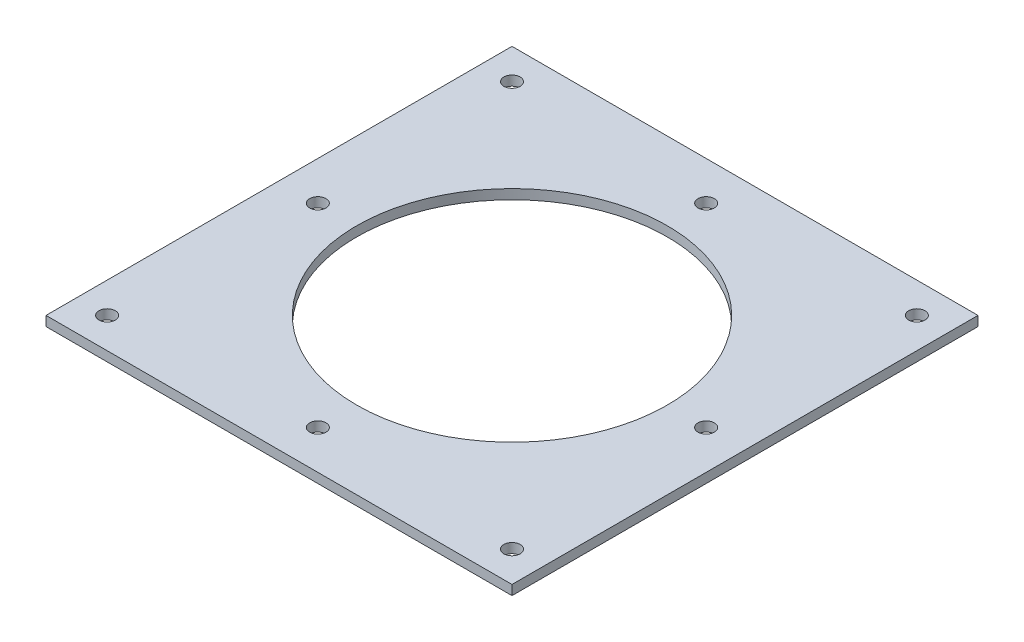
ISO-10303-21;
HEADER;
FILE_DESCRIPTION(('STEP AP214'),'2;1');
FILE_NAME('part.step','',(''),(''),'','','');
FILE_SCHEMA(('AUTOMOTIVE_DESIGN { 1 0 10303 214 1 1 1 1 }'));
ENDSEC;
DATA;
#1=APPLICATION_CONTEXT('core data for automotive mechanical design processes');
#2=APPLICATION_PROTOCOL_DEFINITION('international standard','automotive_design',2000,#1);
#3=PRODUCT_CONTEXT('',#1,'mechanical');
#4=PRODUCT('Part','Part','',(#3));
#5=PRODUCT_RELATED_PRODUCT_CATEGORY('part','',(#4));
#6=PRODUCT_DEFINITION_FORMATION('','',#4);
#7=PRODUCT_DEFINITION_CONTEXT('part definition',#1,'design');
#8=PRODUCT_DEFINITION('design','',#6,#7);
#9=PRODUCT_DEFINITION_SHAPE('','',#8);
#10=(LENGTH_UNIT() NAMED_UNIT(*) SI_UNIT(.MILLI.,.METRE.));
#11=(NAMED_UNIT(*) PLANE_ANGLE_UNIT() SI_UNIT($,.RADIAN.));
#12=(NAMED_UNIT(*) SI_UNIT($,.STERADIAN.) SOLID_ANGLE_UNIT());
#13=UNCERTAINTY_MEASURE_WITH_UNIT(LENGTH_MEASURE(1.E-05),#10,'distance_accuracy_value','');
#14=(GEOMETRIC_REPRESENTATION_CONTEXT(3) GLOBAL_UNCERTAINTY_ASSIGNED_CONTEXT((#13)) GLOBAL_UNIT_ASSIGNED_CONTEXT((#10,
#11,#12)) REPRESENTATION_CONTEXT('',''));
#15=CARTESIAN_POINT('',(0.,0.,0.));
#16=DIRECTION('',(0.,0.,1.));
#17=DIRECTION('',(1.,0.,0.));
#18=AXIS2_PLACEMENT_3D('',#15,#16,#17);
#19=CARTESIAN_POINT('',(0.,3.175,0.));
#20=DIRECTION('',(0.,-1.,0.));
#21=DIRECTION('',(0.,0.,-1.));
#22=AXIS2_PLACEMENT_3D('',#19,#20,#21);
#23=PLANE('',#22);
#24=CARTESIAN_POINT('',(3.80130471627234E-13,3.175,-63.5000000000003));
#25=DIRECTION('',(0.,1.,0.));
#26=DIRECTION('',(0.,0.,1.));
#27=AXIS2_PLACEMENT_3D('',#24,#25,#26);
#28=CIRCLE('',#27,2.66500000400001);
#29=CARTESIAN_POINT('',(3.80130471627234E-13,3.175,-60.8349999960003));
#30=VERTEX_POINT('',#29);
#31=EDGE_CURVE('E155',#30,#30,#28,.T.);
#32=ORIENTED_EDGE('',*,*,#31,.F.);
#33=EDGE_LOOP('',(#32));
#34=FACE_BOUND('',#33,.T.);
#35=CARTESIAN_POINT('',(-63.5000000000001,3.175,-4.91794105439425E-13));
#36=DIRECTION('',(0.,1.,0.));
#37=DIRECTION('',(0.,0.,1.));
#38=AXIS2_PLACEMENT_3D('',#35,#36,#37);
#39=CIRCLE('',#38,2.66500000399999);
#40=CARTESIAN_POINT('',(-63.5000000000001,3.175,2.66500000399949));
#41=VERTEX_POINT('',#40);
#42=EDGE_CURVE('E191',#41,#41,#39,.T.);
#43=ORIENTED_EDGE('',*,*,#42,.F.);
#44=EDGE_LOOP('',(#43));
#45=FACE_BOUND('',#44,.T.);
#46=CARTESIAN_POINT('',(0.,3.175,63.4999999999997));
#47=DIRECTION('',(0.,1.,0.));
#48=DIRECTION('',(0.,0.,1.));
#49=AXIS2_PLACEMENT_3D('',#46,#47,#48);
#50=CIRCLE('',#49,2.66500000400001);
#51=CARTESIAN_POINT('',(0.,3.175,66.1650000039997));
#52=VERTEX_POINT('',#51);
#53=EDGE_CURVE('E183',#52,#52,#50,.T.);
#54=ORIENTED_EDGE('',*,*,#53,.F.);
#55=EDGE_LOOP('',(#54));
#56=FACE_BOUND('',#55,.T.);
#57=CARTESIAN_POINT('',(63.4999999999999,3.175,3.79904441238921E-13));
#58=DIRECTION('',(0.,1.,0.));
#59=DIRECTION('',(0.,0.,1.));
#60=AXIS2_PLACEMENT_3D('',#57,#58,#59);
#61=CIRCLE('',#60,2.665000004);
#62=CARTESIAN_POINT('',(63.4999999999999,3.175,2.66500000400038));
#63=VERTEX_POINT('',#62);
#64=EDGE_CURVE('E176',#63,#63,#61,.T.);
#65=ORIENTED_EDGE('',*,*,#64,.F.);
#66=EDGE_LOOP('',(#65));
#67=FACE_BOUND('',#66,.T.);
#68=CARTESIAN_POINT('',(66.2,3.175,66.2));
#69=DIRECTION('',(0.,1.,0.));
#70=DIRECTION('',(0.,0.,-1.));
#71=AXIS2_PLACEMENT_3D('',#68,#69,#70);
#72=CIRCLE('',#71,2.665000004);
#73=CARTESIAN_POINT('',(66.2,3.175,63.534999996));
#74=VERTEX_POINT('',#73);
#75=EDGE_CURVE('E154',#74,#74,#72,.T.);
#76=ORIENTED_EDGE('',*,*,#75,.F.);
#77=EDGE_LOOP('',(#76));
#78=FACE_BOUND('',#77,.T.);
#79=CARTESIAN_POINT('',(66.2,3.175,-66.2));
#80=DIRECTION('',(0.,1.,0.));
#81=DIRECTION('',(0.,0.,1.));
#82=AXIS2_PLACEMENT_3D('',#79,#80,#81);
#83=CIRCLE('',#82,2.665000004);
#84=CARTESIAN_POINT('',(66.2,3.175,-63.534999996));
#85=VERTEX_POINT('',#84);
#86=EDGE_CURVE('E162',#85,#85,#83,.T.);
#87=ORIENTED_EDGE('',*,*,#86,.F.);
#88=EDGE_LOOP('',(#87));
#89=FACE_BOUND('',#88,.T.);
#90=CARTESIAN_POINT('',(-66.2,3.175,-66.2));
#91=DIRECTION('',(0.,1.,0.));
#92=DIRECTION('',(0.,0.,-1.));
#93=AXIS2_PLACEMENT_3D('',#90,#91,#92);
#94=CIRCLE('',#93,2.665000004);
#95=CARTESIAN_POINT('',(-66.2,3.175,-68.865000004));
#96=VERTEX_POINT('',#95);
#97=EDGE_CURVE('E147',#96,#96,#94,.T.);
#98=ORIENTED_EDGE('',*,*,#97,.F.);
#99=EDGE_LOOP('',(#98));
#100=FACE_BOUND('',#99,.T.);
#101=CARTESIAN_POINT('',(-66.2,3.175,66.2));
#102=DIRECTION('',(0.,1.,0.));
#103=DIRECTION('',(0.,0.,1.));
#104=AXIS2_PLACEMENT_3D('',#101,#102,#103);
#105=CIRCLE('',#104,2.665000004);
#106=CARTESIAN_POINT('',(-66.2,3.175,68.865000004));
#107=VERTEX_POINT('',#106);
#108=EDGE_CURVE('E140',#107,#107,#105,.T.);
#109=ORIENTED_EDGE('',*,*,#108,.F.);
#110=EDGE_LOOP('',(#109));
#111=FACE_BOUND('',#110,.T.);
#112=DIRECTION('',(0.,0.,-1.));
#113=VECTOR('',#112,1.);
#114=CARTESIAN_POINT('',(76.2,3.175,76.2));
#115=LINE('',#114,#113);
#116=CARTESIAN_POINT('',(76.2,3.175,76.2));
#117=VERTEX_POINT('',#116);
#118=CARTESIAN_POINT('',(76.2,3.175,-76.2));
#119=VERTEX_POINT('',#118);
#120=EDGE_CURVE('E95',#117,#119,#115,.T.);
#121=ORIENTED_EDGE('',*,*,#120,.T.);
#122=DIRECTION('',(-1.,0.,0.));
#123=VECTOR('',#122,1.);
#124=CARTESIAN_POINT('',(-76.2,3.175,-76.2));
#125=LINE('',#124,#123);
#126=CARTESIAN_POINT('',(-76.2,3.175,-76.2));
#127=VERTEX_POINT('',#126);
#128=EDGE_CURVE('E90',#119,#127,#125,.T.);
#129=ORIENTED_EDGE('',*,*,#128,.T.);
#130=DIRECTION('',(0.,0.,1.));
#131=VECTOR('',#130,1.);
#132=CARTESIAN_POINT('',(-76.2,3.175,76.2));
#133=LINE('',#132,#131);
#134=CARTESIAN_POINT('',(-76.2,3.175,76.2));
#135=VERTEX_POINT('',#134);
#136=EDGE_CURVE('E93',#127,#135,#133,.T.);
#137=ORIENTED_EDGE('',*,*,#136,.T.);
#138=DIRECTION('',(1.,0.,0.));
#139=VECTOR('',#138,1.);
#140=CARTESIAN_POINT('',(-76.2,3.175,76.2));
#141=LINE('',#140,#139);
#142=EDGE_CURVE('E58',#135,#117,#141,.T.);
#143=ORIENTED_EDGE('',*,*,#142,.T.);
#144=EDGE_LOOP('',(#121,#129,#137,#143));
#145=FACE_BOUND('',#144,.T.);
#146=CARTESIAN_POINT('',(0.,3.175,0.));
#147=DIRECTION('',(0.,1.,0.));
#148=DIRECTION('',(0.,0.,1.));
#149=AXIS2_PLACEMENT_3D('',#146,#147,#148);
#150=CIRCLE('',#149,50.8);
#151=CARTESIAN_POINT('',(0.,3.175,50.8));
#152=VERTEX_POINT('',#151);
#153=EDGE_CURVE('E116',#152,#152,#150,.T.);
#154=ORIENTED_EDGE('',*,*,#153,.F.);
#155=EDGE_LOOP('',(#154));
#156=FACE_BOUND('',#155,.T.);
#157=ADVANCED_FACE('F39',(#34,#45,#56,#67,#78,#89,#100,#111,#145,#156),#23,.F.);
#158=CARTESIAN_POINT('',(0.,0.,0.));
#159=DIRECTION('',(0.,-1.,0.));
#160=DIRECTION('',(0.,0.,-1.));
#161=AXIS2_PLACEMENT_3D('',#158,#159,#160);
#162=PLANE('',#161);
#163=CARTESIAN_POINT('',(3.80130471627234E-13,0.,-63.5000000000003));
#164=DIRECTION('',(0.,-1.,0.));
#165=DIRECTION('',(0.,0.,-1.));
#166=AXIS2_PLACEMENT_3D('',#163,#164,#165);
#167=CIRCLE('',#166,2.66500000400001);
#168=CARTESIAN_POINT('',(3.80130471627234E-13,0.,-66.1650000040003));
#169=VERTEX_POINT('',#168);
#170=EDGE_CURVE('E195',#169,#169,#167,.F.);
#171=ORIENTED_EDGE('',*,*,#170,.T.);
#172=EDGE_LOOP('',(#171));
#173=FACE_BOUND('',#172,.T.);
#174=CARTESIAN_POINT('',(-63.5000000000001,0.,-4.91794105439425E-13));
#175=DIRECTION('',(0.,-1.,0.));
#176=DIRECTION('',(0.,0.,-1.));
#177=AXIS2_PLACEMENT_3D('',#174,#175,#176);
#178=CIRCLE('',#177,2.66500000399999);
#179=CARTESIAN_POINT('',(-63.5000000000001,0.,-2.66500000400048));
#180=VERTEX_POINT('',#179);
#181=EDGE_CURVE('E187',#180,#180,#178,.F.);
#182=ORIENTED_EDGE('',*,*,#181,.T.);
#183=EDGE_LOOP('',(#182));
#184=FACE_BOUND('',#183,.T.);
#185=CARTESIAN_POINT('',(0.,0.,63.4999999999997));
#186=DIRECTION('',(0.,-1.,0.));
#187=DIRECTION('',(0.,0.,-1.));
#188=AXIS2_PLACEMENT_3D('',#185,#186,#187);
#189=CIRCLE('',#188,2.66500000400001);
#190=CARTESIAN_POINT('',(0.,0.,60.8349999959997));
#191=VERTEX_POINT('',#190);
#192=EDGE_CURVE('E179',#191,#191,#189,.F.);
#193=ORIENTED_EDGE('',*,*,#192,.T.);
#194=EDGE_LOOP('',(#193));
#195=FACE_BOUND('',#194,.T.);
#196=CARTESIAN_POINT('',(63.4999999999999,0.,3.79904441238921E-13));
#197=DIRECTION('',(0.,-1.,0.));
#198=DIRECTION('',(0.,0.,-1.));
#199=AXIS2_PLACEMENT_3D('',#196,#197,#198);
#200=CIRCLE('',#199,2.665000004);
#201=CARTESIAN_POINT('',(63.4999999999999,0.,-2.66500000399962));
#202=VERTEX_POINT('',#201);
#203=EDGE_CURVE('E173',#202,#202,#200,.F.);
#204=ORIENTED_EDGE('',*,*,#203,.T.);
#205=EDGE_LOOP('',(#204));
#206=FACE_BOUND('',#205,.T.);
#207=CARTESIAN_POINT('',(66.2,0.,66.2));
#208=DIRECTION('',(0.,-1.,0.));
#209=DIRECTION('',(0.,0.,-1.));
#210=AXIS2_PLACEMENT_3D('',#207,#208,#209);
#211=CIRCLE('',#210,2.665000004);
#212=CARTESIAN_POINT('',(66.2,0.,63.534999996));
#213=VERTEX_POINT('',#212);
#214=EDGE_CURVE('E150',#213,#213,#211,.F.);
#215=ORIENTED_EDGE('',*,*,#214,.T.);
#216=EDGE_LOOP('',(#215));
#217=FACE_BOUND('',#216,.T.);
#218=CARTESIAN_POINT('',(66.2,0.,-66.2));
#219=DIRECTION('',(0.,-1.,0.));
#220=DIRECTION('',(0.,0.,-1.));
#221=AXIS2_PLACEMENT_3D('',#218,#219,#220);
#222=CIRCLE('',#221,2.665000004);
#223=CARTESIAN_POINT('',(66.2,0.,-68.865000004));
#224=VERTEX_POINT('',#223);
#225=EDGE_CURVE('E159',#224,#224,#222,.F.);
#226=ORIENTED_EDGE('',*,*,#225,.T.);
#227=EDGE_LOOP('',(#226));
#228=FACE_BOUND('',#227,.T.);
#229=CARTESIAN_POINT('',(-66.2,0.,-66.2));
#230=DIRECTION('',(0.,-1.,0.));
#231=DIRECTION('',(0.,0.,-1.));
#232=AXIS2_PLACEMENT_3D('',#229,#230,#231);
#233=CIRCLE('',#232,2.665000004);
#234=CARTESIAN_POINT('',(-66.2,0.,-68.865000004));
#235=VERTEX_POINT('',#234);
#236=EDGE_CURVE('E166',#235,#235,#233,.F.);
#237=ORIENTED_EDGE('',*,*,#236,.T.);
#238=EDGE_LOOP('',(#237));
#239=FACE_BOUND('',#238,.T.);
#240=CARTESIAN_POINT('',(-66.2,0.,66.2));
#241=DIRECTION('',(0.,-1.,0.));
#242=DIRECTION('',(0.,0.,-1.));
#243=AXIS2_PLACEMENT_3D('',#240,#241,#242);
#244=CIRCLE('',#243,2.665000004);
#245=CARTESIAN_POINT('',(-66.2,0.,63.534999996));
#246=VERTEX_POINT('',#245);
#247=EDGE_CURVE('E144',#246,#246,#244,.F.);
#248=ORIENTED_EDGE('',*,*,#247,.T.);
#249=EDGE_LOOP('',(#248));
#250=FACE_BOUND('',#249,.T.);
#251=DIRECTION('',(0.,0.,-1.));
#252=VECTOR('',#251,1.);
#253=CARTESIAN_POINT('',(76.2,0.,76.2));
#254=LINE('',#253,#252);
#255=CARTESIAN_POINT('',(76.2,0.,76.2));
#256=VERTEX_POINT('',#255);
#257=CARTESIAN_POINT('',(76.2,0.,-76.2));
#258=VERTEX_POINT('',#257);
#259=EDGE_CURVE('E112',#256,#258,#254,.T.);
#260=ORIENTED_EDGE('',*,*,#259,.F.);
#261=DIRECTION('',(1.,0.,0.));
#262=VECTOR('',#261,1.);
#263=CARTESIAN_POINT('',(-76.2,0.,76.2));
#264=LINE('',#263,#262);
#265=CARTESIAN_POINT('',(-76.2,0.,76.2));
#266=VERTEX_POINT('',#265);
#267=EDGE_CURVE('E83',#266,#256,#264,.T.);
#268=ORIENTED_EDGE('',*,*,#267,.F.);
#269=DIRECTION('',(0.,0.,1.));
#270=VECTOR('',#269,1.);
#271=CARTESIAN_POINT('',(-76.2,0.,76.2));
#272=LINE('',#271,#270);
#273=CARTESIAN_POINT('',(-76.2,0.,-76.2));
#274=VERTEX_POINT('',#273);
#275=EDGE_CURVE('E77',#274,#266,#272,.T.);
#276=ORIENTED_EDGE('',*,*,#275,.F.);
#277=DIRECTION('',(-1.,0.,0.));
#278=VECTOR('',#277,1.);
#279=CARTESIAN_POINT('',(-76.2,0.,-76.2));
#280=LINE('',#279,#278);
#281=EDGE_CURVE('E100',#258,#274,#280,.T.);
#282=ORIENTED_EDGE('',*,*,#281,.F.);
#283=EDGE_LOOP('',(#260,#268,#276,#282));
#284=FACE_BOUND('',#283,.T.);
#285=CARTESIAN_POINT('',(0.,0.,0.));
#286=DIRECTION('',(0.,1.,0.));
#287=DIRECTION('',(0.,0.,1.));
#288=AXIS2_PLACEMENT_3D('',#285,#286,#287);
#289=CIRCLE('',#288,50.8);
#290=CARTESIAN_POINT('',(0.,0.,50.8));
#291=VERTEX_POINT('',#290);
#292=EDGE_CURVE('E136',#291,#291,#289,.T.);
#293=ORIENTED_EDGE('',*,*,#292,.T.);
#294=EDGE_LOOP('',(#293));
#295=FACE_BOUND('',#294,.T.);
#296=ADVANCED_FACE('F129',(#173,#184,#195,#206,#217,#228,#239,#250,#284,#295),#162,.T.);
#297=CARTESIAN_POINT('',(76.2,3.175,76.2));
#298=DIRECTION('',(-1.,0.,0.));
#299=DIRECTION('',(0.,0.,1.));
#300=AXIS2_PLACEMENT_3D('',#297,#298,#299);
#301=PLANE('',#300);
#302=ORIENTED_EDGE('',*,*,#259,.T.);
#303=DIRECTION('',(0.,-1.,0.));
#304=VECTOR('',#303,1.);
#305=CARTESIAN_POINT('',(76.2,3.175,-76.2));
#306=LINE('',#305,#304);
#307=EDGE_CURVE('E11',#119,#258,#306,.T.);
#308=ORIENTED_EDGE('',*,*,#307,.F.);
#309=ORIENTED_EDGE('',*,*,#120,.F.);
#310=DIRECTION('',(0.,-1.,0.));
#311=VECTOR('',#310,1.);
#312=CARTESIAN_POINT('',(76.2,3.175,76.2));
#313=LINE('',#312,#311);
#314=EDGE_CURVE('E108',#117,#256,#313,.T.);
#315=ORIENTED_EDGE('',*,*,#314,.T.);
#316=EDGE_LOOP('',(#302,#308,#309,#315));
#317=FACE_BOUND('',#316,.T.);
#318=ADVANCED_FACE('F41',(#317),#301,.F.);
#319=CARTESIAN_POINT('',(-76.2,3.175,-76.2));
#320=DIRECTION('',(0.,0.,1.));
#321=DIRECTION('',(1.,0.,0.));
#322=AXIS2_PLACEMENT_3D('',#319,#320,#321);
#323=PLANE('',#322);
#324=ORIENTED_EDGE('',*,*,#281,.T.);
#325=DIRECTION('',(0.,-1.,0.));
#326=VECTOR('',#325,1.);
#327=CARTESIAN_POINT('',(-76.2,3.175,-76.2));
#328=LINE('',#327,#326);
#329=EDGE_CURVE('E48',#127,#274,#328,.T.);
#330=ORIENTED_EDGE('',*,*,#329,.F.);
#331=ORIENTED_EDGE('',*,*,#128,.F.);
#332=ORIENTED_EDGE('',*,*,#307,.T.);
#333=EDGE_LOOP('',(#324,#330,#331,#332));
#334=FACE_BOUND('',#333,.T.);
#335=ADVANCED_FACE('F99',(#334),#323,.F.);
#336=CARTESIAN_POINT('',(-76.2,3.175,76.2));
#337=DIRECTION('',(1.,0.,0.));
#338=DIRECTION('',(0.,0.,-1.));
#339=AXIS2_PLACEMENT_3D('',#336,#337,#338);
#340=PLANE('',#339);
#341=ORIENTED_EDGE('',*,*,#275,.T.);
#342=DIRECTION('',(0.,-1.,0.));
#343=VECTOR('',#342,1.);
#344=CARTESIAN_POINT('',(-76.2,3.175,76.2));
#345=LINE('',#344,#343);
#346=EDGE_CURVE('E101',#135,#266,#345,.T.);
#347=ORIENTED_EDGE('',*,*,#346,.F.);
#348=ORIENTED_EDGE('',*,*,#136,.F.);
#349=ORIENTED_EDGE('',*,*,#329,.T.);
#350=EDGE_LOOP('',(#341,#347,#348,#349));
#351=FACE_BOUND('',#350,.T.);
#352=ADVANCED_FACE('F102',(#351),#340,.F.);
#353=CARTESIAN_POINT('',(-76.2,3.175,76.2));
#354=DIRECTION('',(0.,0.,-1.));
#355=DIRECTION('',(-1.,0.,0.));
#356=AXIS2_PLACEMENT_3D('',#353,#354,#355);
#357=PLANE('',#356);
#358=ORIENTED_EDGE('',*,*,#267,.T.);
#359=ORIENTED_EDGE('',*,*,#314,.F.);
#360=ORIENTED_EDGE('',*,*,#142,.F.);
#361=ORIENTED_EDGE('',*,*,#346,.T.);
#362=EDGE_LOOP('',(#358,#359,#360,#361));
#363=FACE_BOUND('',#362,.T.);
#364=ADVANCED_FACE('F126',(#363),#357,.F.);
#365=CARTESIAN_POINT('',(0.,3.175,0.));
#366=DIRECTION('',(0.,-1.,0.));
#367=DIRECTION('',(0.,0.,-1.));
#368=AXIS2_PLACEMENT_3D('',#365,#366,#367);
#369=CYLINDRICAL_SURFACE('',#368,50.8);
#370=ORIENTED_EDGE('',*,*,#153,.T.);
#371=EDGE_LOOP('',(#370));
#372=FACE_BOUND('',#371,.T.);
#373=ORIENTED_EDGE('',*,*,#292,.F.);
#374=EDGE_LOOP('',(#373));
#375=FACE_BOUND('',#374,.T.);
#376=ADVANCED_FACE('F225',(#372,#375),#369,.F.);
#377=CARTESIAN_POINT('',(-66.2,-0.00100000000000013,66.2));
#378=DIRECTION('',(0.,1.,0.));
#379=DIRECTION('',(0.,0.,1.));
#380=AXIS2_PLACEMENT_3D('',#377,#378,#379);
#381=CYLINDRICAL_SURFACE('',#380,2.665000004);
#382=ORIENTED_EDGE('',*,*,#247,.F.);
#383=EDGE_LOOP('',(#382));
#384=FACE_BOUND('',#383,.T.);
#385=ORIENTED_EDGE('',*,*,#108,.T.);
#386=EDGE_LOOP('',(#385));
#387=FACE_BOUND('',#386,.T.);
#388=ADVANCED_FACE('F222',(#384,#387),#381,.F.);
#389=CARTESIAN_POINT('',(-66.2,-0.00100000000000013,-66.2));
#390=DIRECTION('',(0.,1.,0.));
#391=DIRECTION('',(0.,0.,1.));
#392=AXIS2_PLACEMENT_3D('',#389,#390,#391);
#393=CYLINDRICAL_SURFACE('',#392,2.665000004);
#394=ORIENTED_EDGE('',*,*,#236,.F.);
#395=EDGE_LOOP('',(#394));
#396=FACE_BOUND('',#395,.T.);
#397=ORIENTED_EDGE('',*,*,#97,.T.);
#398=EDGE_LOOP('',(#397));
#399=FACE_BOUND('',#398,.T.);
#400=ADVANCED_FACE('F224',(#396,#399),#393,.F.);
#401=CARTESIAN_POINT('',(66.2,-0.00100000000000013,-66.2));
#402=DIRECTION('',(0.,1.,0.));
#403=DIRECTION('',(0.,0.,1.));
#404=AXIS2_PLACEMENT_3D('',#401,#402,#403);
#405=CYLINDRICAL_SURFACE('',#404,2.665000004);
#406=ORIENTED_EDGE('',*,*,#225,.F.);
#407=EDGE_LOOP('',(#406));
#408=FACE_BOUND('',#407,.T.);
#409=ORIENTED_EDGE('',*,*,#86,.T.);
#410=EDGE_LOOP('',(#409));
#411=FACE_BOUND('',#410,.T.);
#412=ADVANCED_FACE('F232',(#408,#411),#405,.F.);
#413=CARTESIAN_POINT('',(66.2,-0.00100000000000013,66.2));
#414=DIRECTION('',(0.,1.,0.));
#415=DIRECTION('',(0.,0.,1.));
#416=AXIS2_PLACEMENT_3D('',#413,#414,#415);
#417=CYLINDRICAL_SURFACE('',#416,2.665000004);
#418=ORIENTED_EDGE('',*,*,#214,.F.);
#419=EDGE_LOOP('',(#418));
#420=FACE_BOUND('',#419,.T.);
#421=ORIENTED_EDGE('',*,*,#75,.T.);
#422=EDGE_LOOP('',(#421));
#423=FACE_BOUND('',#422,.T.);
#424=ADVANCED_FACE('F240',(#420,#423),#417,.F.);
#425=CARTESIAN_POINT('',(63.4999999999999,-0.00100000000000013,3.79904441238921E-13));
#426=DIRECTION('',(0.,1.,0.));
#427=DIRECTION('',(0.,0.,1.));
#428=AXIS2_PLACEMENT_3D('',#425,#426,#427);
#429=CYLINDRICAL_SURFACE('',#428,2.665000004);
#430=ORIENTED_EDGE('',*,*,#203,.F.);
#431=EDGE_LOOP('',(#430));
#432=FACE_BOUND('',#431,.T.);
#433=ORIENTED_EDGE('',*,*,#64,.T.);
#434=EDGE_LOOP('',(#433));
#435=FACE_BOUND('',#434,.T.);
#436=ADVANCED_FACE('F305',(#432,#435),#429,.F.);
#437=CARTESIAN_POINT('',(0.,-0.00100000000000013,63.4999999999997));
#438=DIRECTION('',(0.,1.,0.));
#439=DIRECTION('',(0.,0.,1.));
#440=AXIS2_PLACEMENT_3D('',#437,#438,#439);
#441=CYLINDRICAL_SURFACE('',#440,2.66500000400001);
#442=ORIENTED_EDGE('',*,*,#192,.F.);
#443=EDGE_LOOP('',(#442));
#444=FACE_BOUND('',#443,.T.);
#445=ORIENTED_EDGE('',*,*,#53,.T.);
#446=EDGE_LOOP('',(#445));
#447=FACE_BOUND('',#446,.T.);
#448=ADVANCED_FACE('F319',(#444,#447),#441,.F.);
#449=CARTESIAN_POINT('',(-63.5000000000001,-0.00100000000000013,-4.91794105439425E-13));
#450=DIRECTION('',(0.,1.,0.));
#451=DIRECTION('',(0.,0.,1.));
#452=AXIS2_PLACEMENT_3D('',#449,#450,#451);
#453=CYLINDRICAL_SURFACE('',#452,2.66500000399999);
#454=ORIENTED_EDGE('',*,*,#181,.F.);
#455=EDGE_LOOP('',(#454));
#456=FACE_BOUND('',#455,.T.);
#457=ORIENTED_EDGE('',*,*,#42,.T.);
#458=EDGE_LOOP('',(#457));
#459=FACE_BOUND('',#458,.T.);
#460=ADVANCED_FACE('F328',(#456,#459),#453,.F.);
#461=CARTESIAN_POINT('',(3.80130471627234E-13,-0.00100000000000013,-63.5000000000003));
#462=DIRECTION('',(0.,1.,0.));
#463=DIRECTION('',(0.,0.,1.));
#464=AXIS2_PLACEMENT_3D('',#461,#462,#463);
#465=CYLINDRICAL_SURFACE('',#464,2.66500000400001);
#466=ORIENTED_EDGE('',*,*,#170,.F.);
#467=EDGE_LOOP('',(#466));
#468=FACE_BOUND('',#467,.T.);
#469=ORIENTED_EDGE('',*,*,#31,.T.);
#470=EDGE_LOOP('',(#469));
#471=FACE_BOUND('',#470,.T.);
#472=ADVANCED_FACE('F203',(#468,#471),#465,.F.);
#473=CLOSED_SHELL('',(#157,#296,#318,#335,#352,#364,#376,#388,#400,#412,#424,#436,#448,#460,#472));
#474=MANIFOLD_SOLID_BREP('B2',#473);
#475=ADVANCED_BREP_SHAPE_REPRESENTATION('',(#18,#474),#14);
#476=SHAPE_DEFINITION_REPRESENTATION(#9,#475);
ENDSEC;
END-ISO-10303-21;
